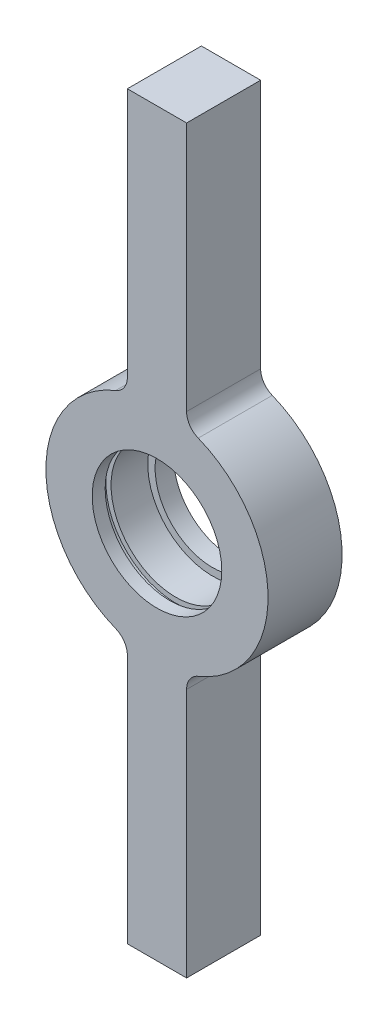
ISO-10303-21;
HEADER;
FILE_DESCRIPTION(('STEP AP214'),'2;1');
FILE_NAME('part.step','',(''),(''),'','','');
FILE_SCHEMA(('AUTOMOTIVE_DESIGN { 1 0 10303 214 1 1 1 1 }'));
ENDSEC;
DATA;
#1=APPLICATION_CONTEXT('core data for automotive mechanical design processes');
#2=APPLICATION_PROTOCOL_DEFINITION('international standard','automotive_design',2000,#1);
#3=PRODUCT_CONTEXT('',#1,'mechanical');
#4=PRODUCT('Part','Part','',(#3));
#5=PRODUCT_RELATED_PRODUCT_CATEGORY('part','',(#4));
#6=PRODUCT_DEFINITION_FORMATION('','',#4);
#7=PRODUCT_DEFINITION_CONTEXT('part definition',#1,'design');
#8=PRODUCT_DEFINITION('design','',#6,#7);
#9=PRODUCT_DEFINITION_SHAPE('','',#8);
#10=(LENGTH_UNIT() NAMED_UNIT(*) SI_UNIT(.MILLI.,.METRE.));
#11=(NAMED_UNIT(*) PLANE_ANGLE_UNIT() SI_UNIT($,.RADIAN.));
#12=(NAMED_UNIT(*) SI_UNIT($,.STERADIAN.) SOLID_ANGLE_UNIT());
#13=UNCERTAINTY_MEASURE_WITH_UNIT(LENGTH_MEASURE(1.E-05),#10,'distance_accuracy_value','');
#14=(GEOMETRIC_REPRESENTATION_CONTEXT(3) GLOBAL_UNCERTAINTY_ASSIGNED_CONTEXT((#13)) GLOBAL_UNIT_ASSIGNED_CONTEXT((#10,
#11,#12)) REPRESENTATION_CONTEXT('',''));
#15=CARTESIAN_POINT('',(0.,0.,0.));
#16=DIRECTION('',(0.,0.,1.));
#17=DIRECTION('',(1.,0.,0.));
#18=AXIS2_PLACEMENT_3D('',#15,#16,#17);
#19=CARTESIAN_POINT('',(0.,0.,0.));
#20=DIRECTION('',(0.,0.,1.));
#21=DIRECTION('',(1.,0.,0.));
#22=AXIS2_PLACEMENT_3D('',#19,#20,#21);
#23=CYLINDRICAL_SURFACE('',#22,17.5);
#24=CARTESIAN_POINT('',(0.,0.,-5.));
#25=DIRECTION('',(0.,0.,1.));
#26=DIRECTION('',(1.,0.,0.));
#27=AXIS2_PLACEMENT_3D('',#24,#25,#26);
#28=CIRCLE('',#27,17.5);
#29=CARTESIAN_POINT('',(17.5,0.,-5.));
#30=VERTEX_POINT('',#29);
#31=EDGE_CURVE('E462',#30,#30,#28,.T.);
#32=ORIENTED_EDGE('',*,*,#31,.F.);
#33=EDGE_LOOP('',(#32));
#34=FACE_BOUND('',#33,.T.);
#35=CARTESIAN_POINT('',(0.,0.,4.9));
#36=DIRECTION('',(0.,0.,1.));
#37=DIRECTION('',(1.,0.,0.));
#38=AXIS2_PLACEMENT_3D('',#35,#36,#37);
#39=CIRCLE('',#38,17.5);
#40=CARTESIAN_POINT('',(17.5,0.,4.9));
#41=VERTEX_POINT('',#40);
#42=EDGE_CURVE('E192',#41,#41,#39,.T.);
#43=ORIENTED_EDGE('',*,*,#42,.T.);
#44=EDGE_LOOP('',(#43));
#45=FACE_BOUND('',#44,.T.);
#46=ADVANCED_FACE('F33',(#34,#45),#23,.F.);
#47=CARTESIAN_POINT('',(0.,0.,10.));
#48=DIRECTION('',(0.,0.,1.));
#49=DIRECTION('',(1.,0.,0.));
#50=AXIS2_PLACEMENT_3D('',#47,#48,#49);
#51=CIRCLE('',#50,17.5);
#52=CARTESIAN_POINT('',(17.5,0.,10.));
#53=VERTEX_POINT('',#52);
#54=EDGE_CURVE('E196',#53,#53,#51,.T.);
#55=ORIENTED_EDGE('',*,*,#54,.T.);
#56=EDGE_LOOP('',(#55));
#57=FACE_BOUND('',#56,.T.);
#58=CARTESIAN_POINT('',(0.,0.,6.5));
#59=DIRECTION('',(0.,0.,-1.));
#60=DIRECTION('',(-1.,0.,0.));
#61=AXIS2_PLACEMENT_3D('',#58,#59,#60);
#62=CIRCLE('',#61,17.5);
#63=CARTESIAN_POINT('',(-17.5,0.,6.5));
#64=VERTEX_POINT('',#63);
#65=EDGE_CURVE('E189',#64,#64,#62,.T.);
#66=ORIENTED_EDGE('',*,*,#65,.T.);
#67=EDGE_LOOP('',(#66));
#68=FACE_BOUND('',#67,.T.);
#69=ADVANCED_FACE('F269',(#57,#68),#23,.F.);
#70=CARTESIAN_POINT('',(0.,0.,10.));
#71=DIRECTION('',(0.,0.,1.));
#72=DIRECTION('',(1.,0.,0.));
#73=AXIS2_PLACEMENT_3D('',#70,#71,#72);
#74=PLANE('',#73);
#75=DIRECTION('',(0.,-1.,0.));
#76=VECTOR('',#75,1.);
#77=CARTESIAN_POINT('',(-8.,100.,10.));
#78=LINE('',#77,#76);
#79=CARTESIAN_POINT('',(-8.,100.,10.));
#80=VERTEX_POINT('',#79);
#81=CARTESIAN_POINT('',(-8.00000000000001,32.4961536185438,10.));
#82=VERTEX_POINT('',#81);
#83=EDGE_CURVE('E165',#80,#82,#78,.T.);
#84=ORIENTED_EDGE('',*,*,#83,.T.);
#85=CARTESIAN_POINT('',(-13.,32.4961536185438,10.));
#86=DIRECTION('',(0.,0.,1.));
#87=DIRECTION('',(1.,0.,0.));
#88=AXIS2_PLACEMENT_3D('',#85,#86,#87);
#89=CIRCLE('',#88,5.);
#90=CARTESIAN_POINT('',(-11.1428571428571,27.8538459587519,10.));
#91=VERTEX_POINT('',#90);
#92=EDGE_CURVE('E223',#82,#91,#89,.F.);
#93=ORIENTED_EDGE('',*,*,#92,.T.);
#94=CARTESIAN_POINT('',(0.,0.,10.));
#95=DIRECTION('',(0.,0.,1.));
#96=DIRECTION('',(1.,0.,0.));
#97=AXIS2_PLACEMENT_3D('',#94,#95,#96);
#98=CIRCLE('',#97,30.);
#99=CARTESIAN_POINT('',(-11.1428571428571,-27.8538459587519,10.));
#100=VERTEX_POINT('',#99);
#101=EDGE_CURVE('E182',#91,#100,#98,.T.);
#102=ORIENTED_EDGE('',*,*,#101,.T.);
#103=CARTESIAN_POINT('',(-13.,-32.4961536185438,10.));
#104=DIRECTION('',(0.,0.,1.));
#105=DIRECTION('',(1.,0.,0.));
#106=AXIS2_PLACEMENT_3D('',#103,#104,#105);
#107=CIRCLE('',#106,5.);
#108=CARTESIAN_POINT('',(-8.00000000000001,-32.4961536185438,10.));
#109=VERTEX_POINT('',#108);
#110=EDGE_CURVE('E144',#100,#109,#107,.F.);
#111=ORIENTED_EDGE('',*,*,#110,.T.);
#112=DIRECTION('',(0.,1.,0.));
#113=VECTOR('',#112,1.);
#114=CARTESIAN_POINT('',(-8.,-100.,10.));
#115=LINE('',#114,#113);
#116=CARTESIAN_POINT('',(-8.,-100.,10.));
#117=VERTEX_POINT('',#116);
#118=EDGE_CURVE('E125',#117,#109,#115,.T.);
#119=ORIENTED_EDGE('',*,*,#118,.F.);
#120=DIRECTION('',(-1.,0.,0.));
#121=VECTOR('',#120,1.);
#122=CARTESIAN_POINT('',(-8.,-100.,10.));
#123=LINE('',#122,#121);
#124=CARTESIAN_POINT('',(8.,-100.,10.));
#125=VERTEX_POINT('',#124);
#126=EDGE_CURVE('E141',#125,#117,#123,.T.);
#127=ORIENTED_EDGE('',*,*,#126,.F.);
#128=DIRECTION('',(0.,-1.,0.));
#129=VECTOR('',#128,1.);
#130=CARTESIAN_POINT('',(8.,-100.,10.));
#131=LINE('',#130,#129);
#132=CARTESIAN_POINT('',(8.00000000000001,-32.4961536185438,10.));
#133=VERTEX_POINT('',#132);
#134=EDGE_CURVE('E145',#133,#125,#131,.T.);
#135=ORIENTED_EDGE('',*,*,#134,.F.);
#136=CARTESIAN_POINT('',(13.,-32.4961536185438,10.));
#137=DIRECTION('',(0.,0.,1.));
#138=DIRECTION('',(1.,0.,0.));
#139=AXIS2_PLACEMENT_3D('',#136,#137,#138);
#140=CIRCLE('',#139,5.);
#141=CARTESIAN_POINT('',(11.1428571428571,-27.8538459587519,10.));
#142=VERTEX_POINT('',#141);
#143=EDGE_CURVE('E216',#133,#142,#140,.F.);
#144=ORIENTED_EDGE('',*,*,#143,.T.);
#145=CARTESIAN_POINT('',(11.1428571428571,27.8538459587519,10.));
#146=VERTEX_POINT('',#145);
#147=EDGE_CURVE('E185',#142,#146,#98,.T.);
#148=ORIENTED_EDGE('',*,*,#147,.T.);
#149=CARTESIAN_POINT('',(13.,32.4961536185438,10.));
#150=DIRECTION('',(0.,0.,1.));
#151=DIRECTION('',(1.,0.,0.));
#152=AXIS2_PLACEMENT_3D('',#149,#150,#151);
#153=CIRCLE('',#152,5.);
#154=CARTESIAN_POINT('',(8.00000000000001,32.4961536185438,10.));
#155=VERTEX_POINT('',#154);
#156=EDGE_CURVE('E11',#146,#155,#153,.F.);
#157=ORIENTED_EDGE('',*,*,#156,.T.);
#158=DIRECTION('',(0.,1.,0.));
#159=VECTOR('',#158,1.);
#160=CARTESIAN_POINT('',(8.,100.,10.));
#161=LINE('',#160,#159);
#162=CARTESIAN_POINT('',(8.,100.,10.));
#163=VERTEX_POINT('',#162);
#164=EDGE_CURVE('E160',#155,#163,#161,.T.);
#165=ORIENTED_EDGE('',*,*,#164,.T.);
#166=DIRECTION('',(-1.,0.,0.));
#167=VECTOR('',#166,1.);
#168=CARTESIAN_POINT('',(-8.,100.,10.));
#169=LINE('',#168,#167);
#170=EDGE_CURVE('E162',#163,#80,#169,.T.);
#171=ORIENTED_EDGE('',*,*,#170,.T.);
#172=EDGE_LOOP('',(#84,#93,#102,#111,#119,#127,#135,#144,#148,#157,#165,#171));
#173=FACE_BOUND('',#172,.T.);
#174=ORIENTED_EDGE('',*,*,#54,.F.);
#175=EDGE_LOOP('',(#174));
#176=FACE_BOUND('',#175,.T.);
#177=ADVANCED_FACE('F138',(#173,#176),#74,.T.);
#178=CARTESIAN_POINT('',(0.,0.,10.));
#179=DIRECTION('',(0.,0.,-1.));
#180=DIRECTION('',(-1.,0.,0.));
#181=AXIS2_PLACEMENT_3D('',#178,#179,#180);
#182=CYLINDRICAL_SURFACE('',#181,15.5);
#183=CARTESIAN_POINT('',(0.,0.,-10.));
#184=DIRECTION('',(0.,0.,1.));
#185=DIRECTION('',(1.,0.,0.));
#186=AXIS2_PLACEMENT_3D('',#183,#184,#185);
#187=CIRCLE('',#186,15.5);
#188=CARTESIAN_POINT('',(15.5,0.,-10.));
#189=VERTEX_POINT('',#188);
#190=EDGE_CURVE('E178',#189,#189,#187,.T.);
#191=ORIENTED_EDGE('',*,*,#190,.F.);
#192=EDGE_LOOP('',(#191));
#193=FACE_BOUND('',#192,.T.);
#194=CARTESIAN_POINT('',(0.,0.,-5.));
#195=DIRECTION('',(0.,0.,1.));
#196=DIRECTION('',(1.,0.,0.));
#197=AXIS2_PLACEMENT_3D('',#194,#195,#196);
#198=CIRCLE('',#197,15.5);
#199=CARTESIAN_POINT('',(15.5,0.,-5.));
#200=VERTEX_POINT('',#199);
#201=EDGE_CURVE('E156',#200,#200,#198,.T.);
#202=ORIENTED_EDGE('',*,*,#201,.T.);
#203=EDGE_LOOP('',(#202));
#204=FACE_BOUND('',#203,.T.);
#205=ADVANCED_FACE('F300',(#193,#204),#182,.F.);
#206=CARTESIAN_POINT('',(0.,0.,10.));
#207=DIRECTION('',(0.,0.,-1.));
#208=DIRECTION('',(-1.,0.,0.));
#209=AXIS2_PLACEMENT_3D('',#206,#207,#208);
#210=CYLINDRICAL_SURFACE('',#209,30.);
#211=ORIENTED_EDGE('',*,*,#147,.F.);
#212=DIRECTION('',(0.,0.,-1.));
#213=VECTOR('',#212,1.);
#214=CARTESIAN_POINT('',(11.1428571428571,-27.8538459587519,10.));
#215=LINE('',#214,#213);
#216=CARTESIAN_POINT('',(11.1428571428571,-27.8538459587519,-10.));
#217=VERTEX_POINT('',#216);
#218=EDGE_CURVE('E198',#142,#217,#215,.T.);
#219=ORIENTED_EDGE('',*,*,#218,.T.);
#220=CARTESIAN_POINT('',(0.,0.,-10.));
#221=DIRECTION('',(0.,0.,1.));
#222=DIRECTION('',(1.,0.,0.));
#223=AXIS2_PLACEMENT_3D('',#220,#221,#222);
#224=CIRCLE('',#223,30.);
#225=CARTESIAN_POINT('',(11.1428571428571,27.8538459587519,-10.));
#226=VERTEX_POINT('',#225);
#227=EDGE_CURVE('E181',#217,#226,#224,.T.);
#228=ORIENTED_EDGE('',*,*,#227,.T.);
#229=DIRECTION('',(0.,0.,-1.));
#230=VECTOR('',#229,1.);
#231=CARTESIAN_POINT('',(11.1428571428571,27.8538459587519,10.));
#232=LINE('',#231,#230);
#233=EDGE_CURVE('E184',#226,#146,#232,.F.);
#234=ORIENTED_EDGE('',*,*,#233,.T.);
#235=EDGE_LOOP('',(#211,#219,#228,#234));
#236=FACE_BOUND('',#235,.T.);
#237=ADVANCED_FACE('F233',(#236),#210,.T.);
#238=CARTESIAN_POINT('',(-11.1428571428571,27.8538459587519,-10.));
#239=VERTEX_POINT('',#238);
#240=CARTESIAN_POINT('',(-11.1428571428571,-27.8538459587519,-10.));
#241=VERTEX_POINT('',#240);
#242=EDGE_CURVE('E186',#239,#241,#224,.T.);
#243=ORIENTED_EDGE('',*,*,#242,.T.);
#244=DIRECTION('',(0.,0.,-1.));
#245=VECTOR('',#244,1.);
#246=CARTESIAN_POINT('',(-11.1428571428571,-27.8538459587519,10.));
#247=LINE('',#246,#245);
#248=EDGE_CURVE('E208',#241,#100,#247,.F.);
#249=ORIENTED_EDGE('',*,*,#248,.T.);
#250=ORIENTED_EDGE('',*,*,#101,.F.);
#251=DIRECTION('',(0.,0.,-1.));
#252=VECTOR('',#251,1.);
#253=CARTESIAN_POINT('',(-11.1428571428571,27.8538459587519,10.));
#254=LINE('',#253,#252);
#255=EDGE_CURVE('E205',#91,#239,#254,.T.);
#256=ORIENTED_EDGE('',*,*,#255,.T.);
#257=EDGE_LOOP('',(#243,#249,#250,#256));
#258=FACE_BOUND('',#257,.T.);
#259=ADVANCED_FACE('F254',(#258),#210,.T.);
#260=CARTESIAN_POINT('',(0.,0.,-10.));
#261=DIRECTION('',(0.,0.,1.));
#262=DIRECTION('',(1.,0.,0.));
#263=AXIS2_PLACEMENT_3D('',#260,#261,#262);
#264=PLANE('',#263);
#265=ORIENTED_EDGE('',*,*,#227,.F.);
#266=CARTESIAN_POINT('',(13.,-32.4961536185438,-10.));
#267=DIRECTION('',(0.,0.,1.));
#268=DIRECTION('',(1.,0.,0.));
#269=AXIS2_PLACEMENT_3D('',#266,#267,#268);
#270=CIRCLE('',#269,5.);
#271=CARTESIAN_POINT('',(8.00000000000001,-32.4961536185438,-10.));
#272=VERTEX_POINT('',#271);
#273=EDGE_CURVE('E214',#217,#272,#270,.T.);
#274=ORIENTED_EDGE('',*,*,#273,.T.);
#275=DIRECTION('',(0.,-1.,0.));
#276=VECTOR('',#275,1.);
#277=CARTESIAN_POINT('',(8.,-100.,-10.));
#278=LINE('',#277,#276);
#279=CARTESIAN_POINT('',(8.,-100.,-10.));
#280=VERTEX_POINT('',#279);
#281=EDGE_CURVE('E154',#272,#280,#278,.T.);
#282=ORIENTED_EDGE('',*,*,#281,.T.);
#283=DIRECTION('',(-1.,0.,0.));
#284=VECTOR('',#283,1.);
#285=CARTESIAN_POINT('',(-8.,-100.,-10.));
#286=LINE('',#285,#284);
#287=CARTESIAN_POINT('',(-8.,-100.,-10.));
#288=VERTEX_POINT('',#287);
#289=EDGE_CURVE('E158',#280,#288,#286,.T.);
#290=ORIENTED_EDGE('',*,*,#289,.T.);
#291=DIRECTION('',(0.,1.,0.));
#292=VECTOR('',#291,1.);
#293=CARTESIAN_POINT('',(-8.,-100.,-10.));
#294=LINE('',#293,#292);
#295=CARTESIAN_POINT('',(-8.00000000000001,-32.4961536185438,-10.));
#296=VERTEX_POINT('',#295);
#297=EDGE_CURVE('E128',#288,#296,#294,.T.);
#298=ORIENTED_EDGE('',*,*,#297,.T.);
#299=CARTESIAN_POINT('',(-13.,-32.4961536185438,-10.));
#300=DIRECTION('',(0.,0.,1.));
#301=DIRECTION('',(1.,0.,0.));
#302=AXIS2_PLACEMENT_3D('',#299,#300,#301);
#303=CIRCLE('',#302,5.);
#304=EDGE_CURVE('E218',#296,#241,#303,.T.);
#305=ORIENTED_EDGE('',*,*,#304,.T.);
#306=ORIENTED_EDGE('',*,*,#242,.F.);
#307=CARTESIAN_POINT('',(-13.,32.4961536185438,-10.));
#308=DIRECTION('',(0.,0.,1.));
#309=DIRECTION('',(1.,0.,0.));
#310=AXIS2_PLACEMENT_3D('',#307,#308,#309);
#311=CIRCLE('',#310,5.);
#312=CARTESIAN_POINT('',(-8.00000000000001,32.4961536185438,-10.));
#313=VERTEX_POINT('',#312);
#314=EDGE_CURVE('E221',#239,#313,#311,.T.);
#315=ORIENTED_EDGE('',*,*,#314,.T.);
#316=DIRECTION('',(0.,-1.,0.));
#317=VECTOR('',#316,1.);
#318=CARTESIAN_POINT('',(-8.,100.,-10.));
#319=LINE('',#318,#317);
#320=CARTESIAN_POINT('',(-8.,100.,-10.));
#321=VERTEX_POINT('',#320);
#322=EDGE_CURVE('E163',#321,#313,#319,.T.);
#323=ORIENTED_EDGE('',*,*,#322,.F.);
#324=DIRECTION('',(-1.,0.,0.));
#325=VECTOR('',#324,1.);
#326=CARTESIAN_POINT('',(-8.,100.,-10.));
#327=LINE('',#326,#325);
#328=CARTESIAN_POINT('',(8.,100.,-10.));
#329=VERTEX_POINT('',#328);
#330=EDGE_CURVE('E169',#329,#321,#327,.T.);
#331=ORIENTED_EDGE('',*,*,#330,.F.);
#332=DIRECTION('',(0.,1.,0.));
#333=VECTOR('',#332,1.);
#334=CARTESIAN_POINT('',(8.,100.,-10.));
#335=LINE('',#334,#333);
#336=CARTESIAN_POINT('',(8.00000000000001,32.4961536185438,-10.));
#337=VERTEX_POINT('',#336);
#338=EDGE_CURVE('E133',#337,#329,#335,.T.);
#339=ORIENTED_EDGE('',*,*,#338,.F.);
#340=CARTESIAN_POINT('',(13.,32.4961536185438,-10.));
#341=DIRECTION('',(0.,0.,1.));
#342=DIRECTION('',(1.,0.,0.));
#343=AXIS2_PLACEMENT_3D('',#340,#341,#342);
#344=CIRCLE('',#343,5.);
#345=EDGE_CURVE('E41',#337,#226,#344,.T.);
#346=ORIENTED_EDGE('',*,*,#345,.T.);
#347=EDGE_LOOP('',(#265,#274,#282,#290,#298,#305,#306,#315,#323,#331,#339,#346));
#348=FACE_BOUND('',#347,.T.);
#349=ORIENTED_EDGE('',*,*,#190,.T.);
#350=EDGE_LOOP('',(#349));
#351=FACE_BOUND('',#350,.T.);
#352=ADVANCED_FACE('F228',(#348,#351),#264,.F.);
#353=CARTESIAN_POINT('',(8.,100.,10.));
#354=DIRECTION('',(-1.,0.,0.));
#355=DIRECTION('',(0.,-1.,0.));
#356=AXIS2_PLACEMENT_3D('',#353,#354,#355);
#357=PLANE('',#356);
#358=ORIENTED_EDGE('',*,*,#164,.F.);
#359=DIRECTION('',(0.,0.,1.));
#360=VECTOR('',#359,1.);
#361=CARTESIAN_POINT('',(8.00000000000001,32.4961536185438,-10.));
#362=LINE('',#361,#360);
#363=EDGE_CURVE('E212',#155,#337,#362,.F.);
#364=ORIENTED_EDGE('',*,*,#363,.T.);
#365=ORIENTED_EDGE('',*,*,#338,.T.);
#366=DIRECTION('',(0.,0.,-1.));
#367=VECTOR('',#366,1.);
#368=CARTESIAN_POINT('',(8.,100.,10.));
#369=LINE('',#368,#367);
#370=EDGE_CURVE('E175',#163,#329,#369,.T.);
#371=ORIENTED_EDGE('',*,*,#370,.F.);
#372=EDGE_LOOP('',(#358,#364,#365,#371));
#373=FACE_BOUND('',#372,.T.);
#374=ADVANCED_FACE('F236',(#373),#357,.F.);
#375=CARTESIAN_POINT('',(-8.,100.,10.));
#376=DIRECTION('',(0.,-1.,0.));
#377=DIRECTION('',(0.,0.,-1.));
#378=AXIS2_PLACEMENT_3D('',#375,#376,#377);
#379=PLANE('',#378);
#380=ORIENTED_EDGE('',*,*,#330,.T.);
#381=DIRECTION('',(0.,0.,-1.));
#382=VECTOR('',#381,1.);
#383=CARTESIAN_POINT('',(-8.,100.,10.));
#384=LINE('',#383,#382);
#385=EDGE_CURVE('E167',#80,#321,#384,.T.);
#386=ORIENTED_EDGE('',*,*,#385,.F.);
#387=ORIENTED_EDGE('',*,*,#170,.F.);
#388=ORIENTED_EDGE('',*,*,#370,.T.);
#389=EDGE_LOOP('',(#380,#386,#387,#388));
#390=FACE_BOUND('',#389,.T.);
#391=ADVANCED_FACE('F241',(#390),#379,.F.);
#392=CARTESIAN_POINT('',(-8.,100.,10.));
#393=DIRECTION('',(1.,0.,0.));
#394=DIRECTION('',(0.,1.,0.));
#395=AXIS2_PLACEMENT_3D('',#392,#393,#394);
#396=PLANE('',#395);
#397=ORIENTED_EDGE('',*,*,#322,.T.);
#398=DIRECTION('',(0.,0.,1.));
#399=VECTOR('',#398,1.);
#400=CARTESIAN_POINT('',(-8.00000000000001,32.4961536185438,10.));
#401=LINE('',#400,#399);
#402=EDGE_CURVE('E210',#313,#82,#401,.T.);
#403=ORIENTED_EDGE('',*,*,#402,.T.);
#404=ORIENTED_EDGE('',*,*,#83,.F.);
#405=ORIENTED_EDGE('',*,*,#385,.T.);
#406=EDGE_LOOP('',(#397,#403,#404,#405));
#407=FACE_BOUND('',#406,.T.);
#408=ADVANCED_FACE('F245',(#407),#396,.F.);
#409=CARTESIAN_POINT('',(8.,-100.,10.));
#410=DIRECTION('',(1.,0.,0.));
#411=DIRECTION('',(0.,1.,0.));
#412=AXIS2_PLACEMENT_3D('',#409,#410,#411);
#413=PLANE('',#412);
#414=ORIENTED_EDGE('',*,*,#281,.F.);
#415=DIRECTION('',(0.,0.,-1.));
#416=VECTOR('',#415,1.);
#417=CARTESIAN_POINT('',(8.00000000000001,-32.4961536185438,10.));
#418=LINE('',#417,#416);
#419=EDGE_CURVE('E201',#272,#133,#418,.F.);
#420=ORIENTED_EDGE('',*,*,#419,.T.);
#421=ORIENTED_EDGE('',*,*,#134,.T.);
#422=DIRECTION('',(0.,0.,-1.));
#423=VECTOR('',#422,1.);
#424=CARTESIAN_POINT('',(8.,-100.,10.));
#425=LINE('',#424,#423);
#426=EDGE_CURVE('E134',#125,#280,#425,.T.);
#427=ORIENTED_EDGE('',*,*,#426,.T.);
#428=EDGE_LOOP('',(#414,#420,#421,#427));
#429=FACE_BOUND('',#428,.T.);
#430=ADVANCED_FACE('F290',(#429),#413,.T.);
#431=CARTESIAN_POINT('',(-8.,-100.,10.));
#432=DIRECTION('',(-1.,0.,0.));
#433=DIRECTION('',(0.,-1.,0.));
#434=AXIS2_PLACEMENT_3D('',#431,#432,#433);
#435=PLANE('',#434);
#436=ORIENTED_EDGE('',*,*,#118,.T.);
#437=DIRECTION('',(0.,0.,-1.));
#438=VECTOR('',#437,1.);
#439=CARTESIAN_POINT('',(-8.00000000000001,-32.4961536185438,10.));
#440=LINE('',#439,#438);
#441=EDGE_CURVE('E203',#109,#296,#440,.T.);
#442=ORIENTED_EDGE('',*,*,#441,.T.);
#443=ORIENTED_EDGE('',*,*,#297,.F.);
#444=DIRECTION('',(0.,0.,-1.));
#445=VECTOR('',#444,1.);
#446=CARTESIAN_POINT('',(-8.,-100.,10.));
#447=LINE('',#446,#445);
#448=EDGE_CURVE('E121',#117,#288,#447,.T.);
#449=ORIENTED_EDGE('',*,*,#448,.F.);
#450=EDGE_LOOP('',(#436,#442,#443,#449));
#451=FACE_BOUND('',#450,.T.);
#452=ADVANCED_FACE('F123',(#451),#435,.T.);
#453=CARTESIAN_POINT('',(-8.,-100.,10.));
#454=DIRECTION('',(0.,-1.,0.));
#455=DIRECTION('',(0.,0.,-1.));
#456=AXIS2_PLACEMENT_3D('',#453,#454,#455);
#457=PLANE('',#456);
#458=ORIENTED_EDGE('',*,*,#289,.F.);
#459=ORIENTED_EDGE('',*,*,#426,.F.);
#460=ORIENTED_EDGE('',*,*,#126,.T.);
#461=ORIENTED_EDGE('',*,*,#448,.T.);
#462=EDGE_LOOP('',(#458,#459,#460,#461));
#463=FACE_BOUND('',#462,.T.);
#464=ADVANCED_FACE('F148',(#463),#457,.T.);
#465=CARTESIAN_POINT('',(0.,15.5,-5.));
#466=DIRECTION('',(0.,0.,1.));
#467=DIRECTION('',(1.,0.,0.));
#468=AXIS2_PLACEMENT_3D('',#465,#466,#467);
#469=PLANE('',#468);
#470=ORIENTED_EDGE('',*,*,#31,.T.);
#471=EDGE_LOOP('',(#470));
#472=FACE_BOUND('',#471,.T.);
#473=ORIENTED_EDGE('',*,*,#201,.F.);
#474=EDGE_LOOP('',(#473));
#475=FACE_BOUND('',#474,.T.);
#476=ADVANCED_FACE('F282',(#472,#475),#469,.T.);
#477=CARTESIAN_POINT('',(0.,17.,4.9));
#478=DIRECTION('',(0.,0.,1.));
#479=DIRECTION('',(1.,0.,0.));
#480=AXIS2_PLACEMENT_3D('',#477,#478,#479);
#481=PLANE('',#480);
#482=ORIENTED_EDGE('',*,*,#42,.F.);
#483=EDGE_LOOP('',(#482));
#484=FACE_BOUND('',#483,.T.);
#485=CARTESIAN_POINT('',(0.,0.,4.9));
#486=DIRECTION('',(0.,0.,1.));
#487=DIRECTION('',(1.,0.,0.));
#488=AXIS2_PLACEMENT_3D('',#485,#486,#487);
#489=CIRCLE('',#488,18.9);
#490=CARTESIAN_POINT('',(18.9,0.,4.9));
#491=VERTEX_POINT('',#490);
#492=EDGE_CURVE('E193',#491,#491,#489,.T.);
#493=ORIENTED_EDGE('',*,*,#492,.T.);
#494=EDGE_LOOP('',(#493));
#495=FACE_BOUND('',#494,.T.);
#496=ADVANCED_FACE('F280',(#484,#495),#481,.T.);
#497=CARTESIAN_POINT('',(0.,0.,0.));
#498=DIRECTION('',(0.,0.,1.));
#499=DIRECTION('',(1.,0.,0.));
#500=AXIS2_PLACEMENT_3D('',#497,#498,#499);
#501=CYLINDRICAL_SURFACE('',#500,18.9);
#502=CARTESIAN_POINT('',(0.,0.,6.5));
#503=DIRECTION('',(0.,0.,1.));
#504=DIRECTION('',(1.,0.,0.));
#505=AXIS2_PLACEMENT_3D('',#502,#503,#504);
#506=CIRCLE('',#505,18.9);
#507=CARTESIAN_POINT('',(18.9,0.,6.5));
#508=VERTEX_POINT('',#507);
#509=EDGE_CURVE('E455',#508,#508,#506,.T.);
#510=ORIENTED_EDGE('',*,*,#509,.T.);
#511=EDGE_LOOP('',(#510));
#512=FACE_BOUND('',#511,.T.);
#513=ORIENTED_EDGE('',*,*,#492,.F.);
#514=EDGE_LOOP('',(#513));
#515=FACE_BOUND('',#514,.T.);
#516=ADVANCED_FACE('F341',(#512,#515),#501,.F.);
#517=CARTESIAN_POINT('',(0.,18.9,6.5));
#518=DIRECTION('',(0.,0.,-1.));
#519=DIRECTION('',(-1.,0.,0.));
#520=AXIS2_PLACEMENT_3D('',#517,#518,#519);
#521=PLANE('',#520);
#522=ORIENTED_EDGE('',*,*,#65,.F.);
#523=EDGE_LOOP('',(#522));
#524=FACE_BOUND('',#523,.T.);
#525=ORIENTED_EDGE('',*,*,#509,.F.);
#526=EDGE_LOOP('',(#525));
#527=FACE_BOUND('',#526,.T.);
#528=ADVANCED_FACE('F265',(#524,#527),#521,.T.);
#529=CARTESIAN_POINT('',(13.,-32.4961536185438,10.));
#530=DIRECTION('',(0.,0.,-1.));
#531=DIRECTION('',(-1.,0.,0.));
#532=AXIS2_PLACEMENT_3D('',#529,#530,#531);
#533=CYLINDRICAL_SURFACE('',#532,5.);
#534=ORIENTED_EDGE('',*,*,#143,.F.);
#535=ORIENTED_EDGE('',*,*,#419,.F.);
#536=ORIENTED_EDGE('',*,*,#273,.F.);
#537=ORIENTED_EDGE('',*,*,#218,.F.);
#538=EDGE_LOOP('',(#534,#535,#536,#537));
#539=FACE_BOUND('',#538,.T.);
#540=ADVANCED_FACE('F259',(#539),#533,.F.);
#541=CARTESIAN_POINT('',(-13.,-32.4961536185438,10.));
#542=DIRECTION('',(0.,0.,-1.));
#543=DIRECTION('',(-1.,0.,0.));
#544=AXIS2_PLACEMENT_3D('',#541,#542,#543);
#545=CYLINDRICAL_SURFACE('',#544,5.);
#546=ORIENTED_EDGE('',*,*,#110,.F.);
#547=ORIENTED_EDGE('',*,*,#248,.F.);
#548=ORIENTED_EDGE('',*,*,#304,.F.);
#549=ORIENTED_EDGE('',*,*,#441,.F.);
#550=EDGE_LOOP('',(#546,#547,#548,#549));
#551=FACE_BOUND('',#550,.T.);
#552=ADVANCED_FACE('F257',(#551),#545,.F.);
#553=CARTESIAN_POINT('',(-13.,32.4961536185438,10.));
#554=DIRECTION('',(0.,0.,-1.));
#555=DIRECTION('',(-1.,0.,0.));
#556=AXIS2_PLACEMENT_3D('',#553,#554,#555);
#557=CYLINDRICAL_SURFACE('',#556,5.);
#558=ORIENTED_EDGE('',*,*,#92,.F.);
#559=ORIENTED_EDGE('',*,*,#402,.F.);
#560=ORIENTED_EDGE('',*,*,#314,.F.);
#561=ORIENTED_EDGE('',*,*,#255,.F.);
#562=EDGE_LOOP('',(#558,#559,#560,#561));
#563=FACE_BOUND('',#562,.T.);
#564=ADVANCED_FACE('F251',(#563),#557,.F.);
#565=CARTESIAN_POINT('',(13.,32.4961536185438,10.));
#566=DIRECTION('',(0.,0.,-1.));
#567=DIRECTION('',(-1.,0.,0.));
#568=AXIS2_PLACEMENT_3D('',#565,#566,#567);
#569=CYLINDRICAL_SURFACE('',#568,5.);
#570=ORIENTED_EDGE('',*,*,#156,.F.);
#571=ORIENTED_EDGE('',*,*,#233,.F.);
#572=ORIENTED_EDGE('',*,*,#345,.F.);
#573=ORIENTED_EDGE('',*,*,#363,.F.);
#574=EDGE_LOOP('',(#570,#571,#572,#573));
#575=FACE_BOUND('',#574,.T.);
#576=ADVANCED_FACE('F35',(#575),#569,.F.);
#577=CLOSED_SHELL('',(#46,#69,#177,#205,#237,#259,#352,#374,#391,#408,#430,#452,#464,#476,#496,
#516,#528,#540,#552,#564,#576));
#578=MANIFOLD_SOLID_BREP('B2',#577);
#579=ADVANCED_BREP_SHAPE_REPRESENTATION('',(#18,#578),#14);
#580=SHAPE_DEFINITION_REPRESENTATION(#9,#579);
ENDSEC;
END-ISO-10303-21;
